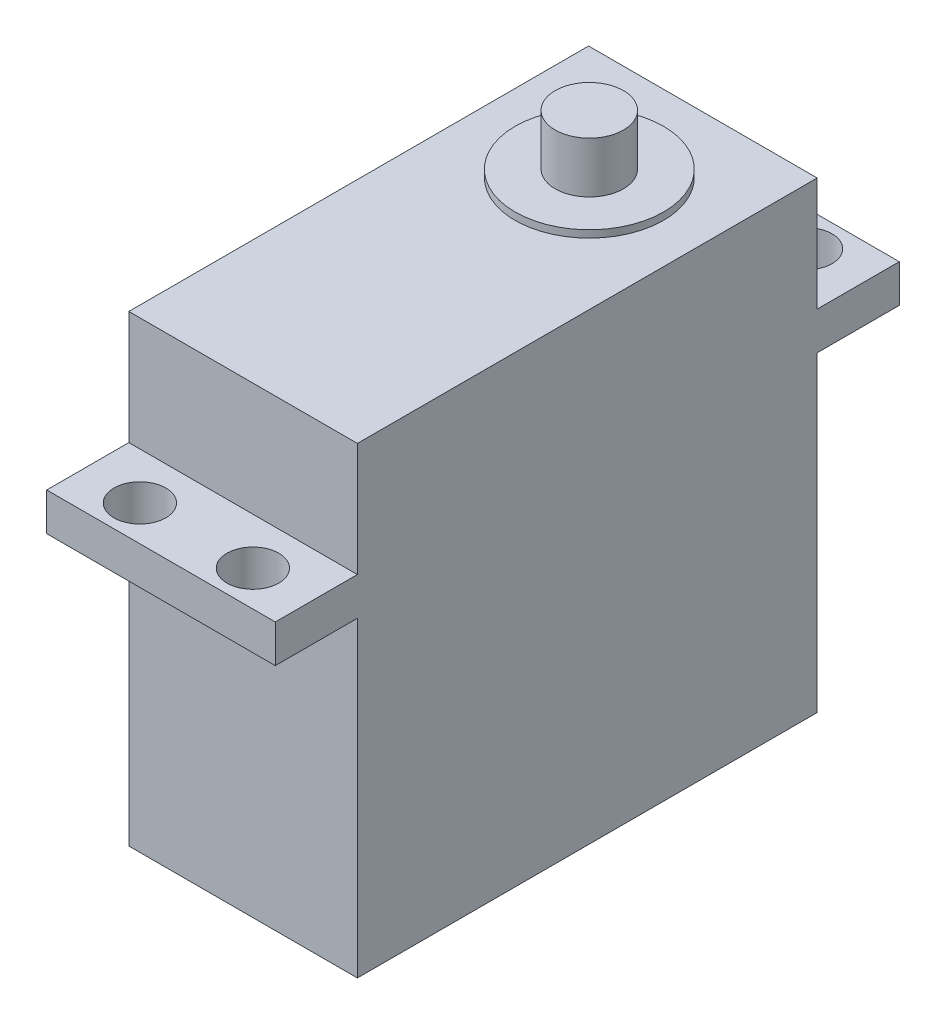
ISO-10303-21;
HEADER;
FILE_DESCRIPTION(('STEP AP214'),'2;1');
FILE_NAME('part.step','',(''),(''),'','','');
FILE_SCHEMA(('AUTOMOTIVE_DESIGN { 1 0 10303 214 1 1 1 1 }'));
ENDSEC;
DATA;
#1=APPLICATION_CONTEXT('core data for automotive mechanical design processes');
#2=APPLICATION_PROTOCOL_DEFINITION('international standard','automotive_design',2000,#1);
#3=PRODUCT_CONTEXT('',#1,'mechanical');
#4=PRODUCT('Part','Part','',(#3));
#5=PRODUCT_RELATED_PRODUCT_CATEGORY('part','',(#4));
#6=PRODUCT_DEFINITION_FORMATION('','',#4);
#7=PRODUCT_DEFINITION_CONTEXT('part definition',#1,'design');
#8=PRODUCT_DEFINITION('design','',#6,#7);
#9=PRODUCT_DEFINITION_SHAPE('','',#8);
#10=(LENGTH_UNIT() NAMED_UNIT(*) SI_UNIT(.MILLI.,.METRE.));
#11=(NAMED_UNIT(*) PLANE_ANGLE_UNIT() SI_UNIT($,.RADIAN.));
#12=(NAMED_UNIT(*) SI_UNIT($,.STERADIAN.) SOLID_ANGLE_UNIT());
#13=UNCERTAINTY_MEASURE_WITH_UNIT(LENGTH_MEASURE(1.E-05),#10,'distance_accuracy_value','');
#14=(GEOMETRIC_REPRESENTATION_CONTEXT(3) GLOBAL_UNCERTAINTY_ASSIGNED_CONTEXT((#13)) GLOBAL_UNIT_ASSIGNED_CONTEXT((#10,
#11,#12)) REPRESENTATION_CONTEXT('',''));
#15=CARTESIAN_POINT('',(0.,0.,0.));
#16=DIRECTION('',(0.,0.,1.));
#17=DIRECTION('',(1.,0.,0.));
#18=AXIS2_PLACEMENT_3D('',#15,#16,#17);
#19=CARTESIAN_POINT('',(19.939,0.,0.));
#20=DIRECTION('',(0.,0.,-1.));
#21=DIRECTION('',(-1.,0.,0.));
#22=AXIS2_PLACEMENT_3D('',#19,#20,#21);
#23=PLANE('',#22);
#24=DIRECTION('',(0.,-1.,0.));
#25=VECTOR('',#24,1.);
#26=CARTESIAN_POINT('',(0.,0.,0.));
#27=LINE('',#26,#25);
#28=CARTESIAN_POINT('',(0.,27.178,0.));
#29=VERTEX_POINT('',#28);
#30=CARTESIAN_POINT('',(0.,0.,0.));
#31=VERTEX_POINT('',#30);
#32=EDGE_CURVE('E168',#29,#31,#27,.T.);
#33=ORIENTED_EDGE('',*,*,#32,.T.);
#34=DIRECTION('',(-1.,0.,0.));
#35=VECTOR('',#34,1.);
#36=CARTESIAN_POINT('',(19.939,0.,0.));
#37=LINE('',#36,#35);
#38=CARTESIAN_POINT('',(19.939,0.,0.));
#39=VERTEX_POINT('',#38);
#40=EDGE_CURVE('E54',#39,#31,#37,.T.);
#41=ORIENTED_EDGE('',*,*,#40,.F.);
#42=DIRECTION('',(0.,-1.,0.));
#43=VECTOR('',#42,1.);
#44=CARTESIAN_POINT('',(19.939,0.,0.));
#45=LINE('',#44,#43);
#46=CARTESIAN_POINT('',(19.939,27.178,0.));
#47=VERTEX_POINT('',#46);
#48=EDGE_CURVE('E191',#47,#39,#45,.T.);
#49=ORIENTED_EDGE('',*,*,#48,.F.);
#50=DIRECTION('',(-1.,0.,0.));
#51=VECTOR('',#50,1.);
#52=CARTESIAN_POINT('',(19.939,27.178,0.));
#53=LINE('',#52,#51);
#54=EDGE_CURVE('E164',#47,#29,#53,.T.);
#55=ORIENTED_EDGE('',*,*,#54,.T.);
#56=EDGE_LOOP('',(#33,#41,#49,#55));
#57=FACE_BOUND('',#56,.T.);
#58=ADVANCED_FACE('F45',(#57),#23,.F.);
#59=CARTESIAN_POINT('',(19.939,0.,0.));
#60=DIRECTION('',(0.,1.,0.));
#61=DIRECTION('',(0.,0.,1.));
#62=AXIS2_PLACEMENT_3D('',#59,#60,#61);
#63=PLANE('',#62);
#64=DIRECTION('',(0.,0.,-1.));
#65=VECTOR('',#64,1.);
#66=CARTESIAN_POINT('',(0.,0.,0.));
#67=LINE('',#66,#65);
#68=CARTESIAN_POINT('',(0.,0.,-40.1066));
#69=VERTEX_POINT('',#68);
#70=EDGE_CURVE('E171',#31,#69,#67,.T.);
#71=ORIENTED_EDGE('',*,*,#70,.T.);
#72=DIRECTION('',(-1.,0.,0.));
#73=VECTOR('',#72,1.);
#74=CARTESIAN_POINT('',(19.939,0.,-40.1066));
#75=LINE('',#74,#73);
#76=CARTESIAN_POINT('',(19.939,0.,-40.1066));
#77=VERTEX_POINT('',#76);
#78=EDGE_CURVE('E213',#77,#69,#75,.T.);
#79=ORIENTED_EDGE('',*,*,#78,.F.);
#80=DIRECTION('',(0.,0.,-1.));
#81=VECTOR('',#80,1.);
#82=CARTESIAN_POINT('',(19.939,0.,0.));
#83=LINE('',#82,#81);
#84=EDGE_CURVE('E119',#39,#77,#83,.T.);
#85=ORIENTED_EDGE('',*,*,#84,.F.);
#86=ORIENTED_EDGE('',*,*,#40,.T.);
#87=EDGE_LOOP('',(#71,#79,#85,#86));
#88=FACE_BOUND('',#87,.T.);
#89=ADVANCED_FACE('F290',(#88),#63,.F.);
#90=CARTESIAN_POINT('',(19.939,0.,-40.1066));
#91=DIRECTION('',(0.,0.,1.));
#92=DIRECTION('',(0.,-1.,0.));
#93=AXIS2_PLACEMENT_3D('',#90,#91,#92);
#94=PLANE('',#93);
#95=DIRECTION('',(0.,1.,0.));
#96=VECTOR('',#95,1.);
#97=CARTESIAN_POINT('',(0.,0.,-40.1066));
#98=LINE('',#97,#96);
#99=CARTESIAN_POINT('',(0.,27.178,-40.1066));
#100=VERTEX_POINT('',#99);
#101=EDGE_CURVE('E174',#69,#100,#98,.T.);
#102=ORIENTED_EDGE('',*,*,#101,.T.);
#103=DIRECTION('',(-1.,0.,0.));
#104=VECTOR('',#103,1.);
#105=CARTESIAN_POINT('',(19.939,27.178,-40.1066));
#106=LINE('',#105,#104);
#107=CARTESIAN_POINT('',(19.939,27.178,-40.1066));
#108=VERTEX_POINT('',#107);
#109=EDGE_CURVE('E210',#108,#100,#106,.T.);
#110=ORIENTED_EDGE('',*,*,#109,.F.);
#111=DIRECTION('',(0.,1.,0.));
#112=VECTOR('',#111,1.);
#113=CARTESIAN_POINT('',(19.939,0.,-40.1066));
#114=LINE('',#113,#112);
#115=EDGE_CURVE('E250',#77,#108,#114,.T.);
#116=ORIENTED_EDGE('',*,*,#115,.F.);
#117=ORIENTED_EDGE('',*,*,#78,.T.);
#118=EDGE_LOOP('',(#102,#110,#116,#117));
#119=FACE_BOUND('',#118,.T.);
#120=ADVANCED_FACE('F294',(#119),#94,.F.);
#121=CARTESIAN_POINT('',(19.939,27.178,-40.1066));
#122=DIRECTION('',(0.,1.,0.));
#123=DIRECTION('',(0.,0.,1.));
#124=AXIS2_PLACEMENT_3D('',#121,#122,#123);
#125=PLANE('',#124);
#126=CARTESIAN_POINT('',(14.8971,27.178,-44.1833));
#127=DIRECTION('',(0.,1.,0.));
#128=DIRECTION('',(0.,0.,1.));
#129=AXIS2_PLACEMENT_3D('',#126,#127,#128);
#130=CIRCLE('',#129,2.2606);
#131=CARTESIAN_POINT('',(14.8971,27.178,-41.9227));
#132=VERTEX_POINT('',#131);
#133=EDGE_CURVE('E241',#132,#132,#130,.T.);
#134=ORIENTED_EDGE('',*,*,#133,.T.);
#135=EDGE_LOOP('',(#134));
#136=FACE_BOUND('',#135,.T.);
#137=CARTESIAN_POINT('',(5.04189999999999,27.178,-44.1833));
#138=DIRECTION('',(0.,1.,0.));
#139=DIRECTION('',(0.,0.,1.));
#140=AXIS2_PLACEMENT_3D('',#137,#138,#139);
#141=CIRCLE('',#140,2.2606);
#142=CARTESIAN_POINT('',(5.04189999999999,27.178,-41.9227));
#143=VERTEX_POINT('',#142);
#144=EDGE_CURVE('E226',#143,#143,#141,.T.);
#145=ORIENTED_EDGE('',*,*,#144,.T.);
#146=EDGE_LOOP('',(#145));
#147=FACE_BOUND('',#146,.T.);
#148=DIRECTION('',(0.,0.,-1.));
#149=VECTOR('',#148,1.);
#150=CARTESIAN_POINT('',(0.,27.178,-40.1066));
#151=LINE('',#150,#149);
#152=CARTESIAN_POINT('',(0.,27.178,-47.2694));
#153=VERTEX_POINT('',#152);
#154=EDGE_CURVE('E176',#100,#153,#151,.T.);
#155=ORIENTED_EDGE('',*,*,#154,.T.);
#156=DIRECTION('',(-1.,0.,0.));
#157=VECTOR('',#156,1.);
#158=CARTESIAN_POINT('',(19.939,27.178,-47.2694));
#159=LINE('',#158,#157);
#160=CARTESIAN_POINT('',(19.939,27.178,-47.2694));
#161=VERTEX_POINT('',#160);
#162=EDGE_CURVE('E207',#161,#153,#159,.T.);
#163=ORIENTED_EDGE('',*,*,#162,.F.);
#164=DIRECTION('',(0.,0.,-1.));
#165=VECTOR('',#164,1.);
#166=CARTESIAN_POINT('',(19.939,27.178,-40.1066));
#167=LINE('',#166,#165);
#168=EDGE_CURVE('E252',#108,#161,#167,.T.);
#169=ORIENTED_EDGE('',*,*,#168,.F.);
#170=ORIENTED_EDGE('',*,*,#109,.T.);
#171=EDGE_LOOP('',(#155,#163,#169,#170));
#172=FACE_BOUND('',#171,.T.);
#173=ADVANCED_FACE('F298',(#136,#147,#172),#125,.F.);
#174=CARTESIAN_POINT('',(19.939,30.48,-47.2694));
#175=DIRECTION('',(0.,0.,1.));
#176=DIRECTION('',(0.,-1.,0.));
#177=AXIS2_PLACEMENT_3D('',#174,#175,#176);
#178=PLANE('',#177);
#179=DIRECTION('',(0.,1.,0.));
#180=VECTOR('',#179,1.);
#181=CARTESIAN_POINT('',(0.,30.48,-47.2694));
#182=LINE('',#181,#180);
#183=CARTESIAN_POINT('',(0.,30.48,-47.2694));
#184=VERTEX_POINT('',#183);
#185=EDGE_CURVE('E178',#153,#184,#182,.T.);
#186=ORIENTED_EDGE('',*,*,#185,.T.);
#187=DIRECTION('',(-1.,0.,0.));
#188=VECTOR('',#187,1.);
#189=CARTESIAN_POINT('',(19.939,30.48,-47.2694));
#190=LINE('',#189,#188);
#191=CARTESIAN_POINT('',(19.939,30.48,-47.2694));
#192=VERTEX_POINT('',#191);
#193=EDGE_CURVE('E204',#192,#184,#190,.T.);
#194=ORIENTED_EDGE('',*,*,#193,.F.);
#195=DIRECTION('',(0.,1.,0.));
#196=VECTOR('',#195,1.);
#197=CARTESIAN_POINT('',(19.939,30.48,-47.2694));
#198=LINE('',#197,#196);
#199=EDGE_CURVE('E254',#161,#192,#198,.T.);
#200=ORIENTED_EDGE('',*,*,#199,.F.);
#201=ORIENTED_EDGE('',*,*,#162,.T.);
#202=EDGE_LOOP('',(#186,#194,#200,#201));
#203=FACE_BOUND('',#202,.T.);
#204=ADVANCED_FACE('F304',(#203),#178,.F.);
#205=CARTESIAN_POINT('',(19.939,30.48,-40.1066));
#206=DIRECTION('',(0.,-1.,0.));
#207=DIRECTION('',(0.,0.,-1.));
#208=AXIS2_PLACEMENT_3D('',#205,#206,#207);
#209=PLANE('',#208);
#210=CARTESIAN_POINT('',(14.8971,30.48,-44.1833));
#211=DIRECTION('',(0.,1.,0.));
#212=DIRECTION('',(0.,0.,-1.));
#213=AXIS2_PLACEMENT_3D('',#210,#211,#212);
#214=CIRCLE('',#213,2.2606);
#215=CARTESIAN_POINT('',(14.8971,30.48,-41.9227));
#216=VERTEX_POINT('',#215);
#217=EDGE_CURVE('E228',#216,#216,#214,.T.);
#218=ORIENTED_EDGE('',*,*,#217,.F.);
#219=EDGE_LOOP('',(#218));
#220=FACE_BOUND('',#219,.T.);
#221=CARTESIAN_POINT('',(5.04189999999999,30.48,-44.1833));
#222=DIRECTION('',(0.,1.,0.));
#223=DIRECTION('',(0.,0.,1.));
#224=AXIS2_PLACEMENT_3D('',#221,#222,#223);
#225=CIRCLE('',#224,2.2606);
#226=CARTESIAN_POINT('',(5.04189999999999,30.48,-41.9227));
#227=VERTEX_POINT('',#226);
#228=EDGE_CURVE('E222',#227,#227,#225,.T.);
#229=ORIENTED_EDGE('',*,*,#228,.F.);
#230=EDGE_LOOP('',(#229));
#231=FACE_BOUND('',#230,.T.);
#232=DIRECTION('',(0.,0.,1.));
#233=VECTOR('',#232,1.);
#234=CARTESIAN_POINT('',(0.,30.48,-40.1066));
#235=LINE('',#234,#233);
#236=CARTESIAN_POINT('',(0.,30.48,-40.1066));
#237=VERTEX_POINT('',#236);
#238=EDGE_CURVE('E180',#184,#237,#235,.T.);
#239=ORIENTED_EDGE('',*,*,#238,.T.);
#240=DIRECTION('',(-1.,0.,0.));
#241=VECTOR('',#240,1.);
#242=CARTESIAN_POINT('',(19.939,30.48,-40.1066));
#243=LINE('',#242,#241);
#244=CARTESIAN_POINT('',(19.939,30.48,-40.1066));
#245=VERTEX_POINT('',#244);
#246=EDGE_CURVE('E201',#245,#237,#243,.T.);
#247=ORIENTED_EDGE('',*,*,#246,.F.);
#248=DIRECTION('',(0.,0.,1.));
#249=VECTOR('',#248,1.);
#250=CARTESIAN_POINT('',(19.939,30.48,-40.1066));
#251=LINE('',#250,#249);
#252=EDGE_CURVE('E256',#192,#245,#251,.T.);
#253=ORIENTED_EDGE('',*,*,#252,.F.);
#254=ORIENTED_EDGE('',*,*,#193,.T.);
#255=EDGE_LOOP('',(#239,#247,#253,#254));
#256=FACE_BOUND('',#255,.T.);
#257=ADVANCED_FACE('F308',(#220,#231,#256),#209,.F.);
#258=CARTESIAN_POINT('',(19.939,30.48,-40.1066));
#259=DIRECTION('',(0.,0.,1.));
#260=DIRECTION('',(1.,0.,0.));
#261=AXIS2_PLACEMENT_3D('',#258,#259,#260);
#262=PLANE('',#261);
#263=DIRECTION('',(0.,1.,0.));
#264=VECTOR('',#263,1.);
#265=CARTESIAN_POINT('',(0.,30.48,-40.1066));
#266=LINE('',#265,#264);
#267=CARTESIAN_POINT('',(0.,40.386,-40.1066));
#268=VERTEX_POINT('',#267);
#269=EDGE_CURVE('E182',#237,#268,#266,.T.);
#270=ORIENTED_EDGE('',*,*,#269,.T.);
#271=DIRECTION('',(-1.,0.,0.));
#272=VECTOR('',#271,1.);
#273=CARTESIAN_POINT('',(19.939,40.386,-40.1066));
#274=LINE('',#273,#272);
#275=CARTESIAN_POINT('',(19.939,40.386,-40.1066));
#276=VERTEX_POINT('',#275);
#277=EDGE_CURVE('E198',#276,#268,#274,.T.);
#278=ORIENTED_EDGE('',*,*,#277,.F.);
#279=DIRECTION('',(0.,1.,0.));
#280=VECTOR('',#279,1.);
#281=CARTESIAN_POINT('',(19.939,30.48,-40.1066));
#282=LINE('',#281,#280);
#283=EDGE_CURVE('E258',#245,#276,#282,.T.);
#284=ORIENTED_EDGE('',*,*,#283,.F.);
#285=ORIENTED_EDGE('',*,*,#246,.T.);
#286=EDGE_LOOP('',(#270,#278,#284,#285));
#287=FACE_BOUND('',#286,.T.);
#288=ADVANCED_FACE('F312',(#287),#262,.F.);
#289=CARTESIAN_POINT('',(19.939,40.386,0.));
#290=DIRECTION('',(0.,-1.,0.));
#291=DIRECTION('',(0.,0.,-1.));
#292=AXIS2_PLACEMENT_3D('',#289,#290,#291);
#293=PLANE('',#292);
#294=CARTESIAN_POINT('',(9.9695,40.386,-30.2006));
#295=DIRECTION('',(0.,-1.,0.));
#296=DIRECTION('',(0.,0.,-1.));
#297=AXIS2_PLACEMENT_3D('',#294,#295,#296);
#298=CIRCLE('',#297,6.477);
#299=CARTESIAN_POINT('',(9.9695,40.386,-36.6776));
#300=VERTEX_POINT('',#299);
#301=EDGE_CURVE('E11',#300,#300,#298,.F.);
#302=ORIENTED_EDGE('',*,*,#301,.F.);
#303=EDGE_LOOP('',(#302));
#304=FACE_BOUND('',#303,.T.);
#305=DIRECTION('',(0.,0.,1.));
#306=VECTOR('',#305,1.);
#307=CARTESIAN_POINT('',(0.,40.386,0.));
#308=LINE('',#307,#306);
#309=CARTESIAN_POINT('',(0.,40.386,0.));
#310=VERTEX_POINT('',#309);
#311=EDGE_CURVE('E184',#268,#310,#308,.T.);
#312=ORIENTED_EDGE('',*,*,#311,.T.);
#313=DIRECTION('',(-1.,0.,0.));
#314=VECTOR('',#313,1.);
#315=CARTESIAN_POINT('',(19.939,40.386,0.));
#316=LINE('',#315,#314);
#317=CARTESIAN_POINT('',(19.939,40.386,0.));
#318=VERTEX_POINT('',#317);
#319=EDGE_CURVE('E195',#318,#310,#316,.T.);
#320=ORIENTED_EDGE('',*,*,#319,.F.);
#321=DIRECTION('',(0.,0.,1.));
#322=VECTOR('',#321,1.);
#323=CARTESIAN_POINT('',(19.939,40.386,0.));
#324=LINE('',#323,#322);
#325=EDGE_CURVE('E260',#276,#318,#324,.T.);
#326=ORIENTED_EDGE('',*,*,#325,.F.);
#327=ORIENTED_EDGE('',*,*,#277,.T.);
#328=EDGE_LOOP('',(#312,#320,#326,#327));
#329=FACE_BOUND('',#328,.T.);
#330=ADVANCED_FACE('F266',(#304,#329),#293,.F.);
#331=CARTESIAN_POINT('',(19.939,30.48,0.));
#332=DIRECTION('',(0.,0.,-1.));
#333=DIRECTION('',(0.,1.,0.));
#334=AXIS2_PLACEMENT_3D('',#331,#332,#333);
#335=PLANE('',#334);
#336=DIRECTION('',(0.,-1.,0.));
#337=VECTOR('',#336,1.);
#338=CARTESIAN_POINT('',(0.,30.48,0.));
#339=LINE('',#338,#337);
#340=CARTESIAN_POINT('',(0.,30.48,0.));
#341=VERTEX_POINT('',#340);
#342=EDGE_CURVE('E186',#310,#341,#339,.T.);
#343=ORIENTED_EDGE('',*,*,#342,.T.);
#344=DIRECTION('',(-1.,0.,0.));
#345=VECTOR('',#344,1.);
#346=CARTESIAN_POINT('',(19.939,30.48,0.));
#347=LINE('',#346,#345);
#348=CARTESIAN_POINT('',(19.939,30.48,0.));
#349=VERTEX_POINT('',#348);
#350=EDGE_CURVE('E159',#349,#341,#347,.T.);
#351=ORIENTED_EDGE('',*,*,#350,.F.);
#352=DIRECTION('',(0.,-1.,0.));
#353=VECTOR('',#352,1.);
#354=CARTESIAN_POINT('',(19.939,30.48,0.));
#355=LINE('',#354,#353);
#356=EDGE_CURVE('E150',#318,#349,#355,.T.);
#357=ORIENTED_EDGE('',*,*,#356,.F.);
#358=ORIENTED_EDGE('',*,*,#319,.T.);
#359=EDGE_LOOP('',(#343,#351,#357,#358));
#360=FACE_BOUND('',#359,.T.);
#361=ADVANCED_FACE('F270',(#360),#335,.F.);
#362=CARTESIAN_POINT('',(19.939,30.48,0.));
#363=DIRECTION('',(0.,-1.,0.));
#364=DIRECTION('',(0.,0.,-1.));
#365=AXIS2_PLACEMENT_3D('',#362,#363,#364);
#366=PLANE('',#365);
#367=CARTESIAN_POINT('',(5.04189999999999,30.48,4.07669999999999));
#368=DIRECTION('',(0.,1.,0.));
#369=DIRECTION('',(0.,0.,-1.));
#370=AXIS2_PLACEMENT_3D('',#367,#368,#369);
#371=CIRCLE('',#370,2.2606);
#372=CARTESIAN_POINT('',(5.04189999999999,30.48,6.33729999999999));
#373=VERTEX_POINT('',#372);
#374=EDGE_CURVE('E237',#373,#373,#371,.T.);
#375=ORIENTED_EDGE('',*,*,#374,.F.);
#376=EDGE_LOOP('',(#375));
#377=FACE_BOUND('',#376,.T.);
#378=CARTESIAN_POINT('',(14.8971,30.48,4.0767));
#379=DIRECTION('',(0.,1.,0.));
#380=DIRECTION('',(0.,0.,1.));
#381=AXIS2_PLACEMENT_3D('',#378,#379,#380);
#382=CIRCLE('',#381,2.2606);
#383=CARTESIAN_POINT('',(14.8971,30.48,6.3373));
#384=VERTEX_POINT('',#383);
#385=EDGE_CURVE('E233',#384,#384,#382,.T.);
#386=ORIENTED_EDGE('',*,*,#385,.F.);
#387=EDGE_LOOP('',(#386));
#388=FACE_BOUND('',#387,.T.);
#389=DIRECTION('',(0.,0.,1.));
#390=VECTOR('',#389,1.);
#391=CARTESIAN_POINT('',(0.,30.48,0.));
#392=LINE('',#391,#390);
#393=CARTESIAN_POINT('',(0.,30.48,7.1628));
#394=VERTEX_POINT('',#393);
#395=EDGE_CURVE('E158',#341,#394,#392,.T.);
#396=ORIENTED_EDGE('',*,*,#395,.T.);
#397=DIRECTION('',(-1.,0.,0.));
#398=VECTOR('',#397,1.);
#399=CARTESIAN_POINT('',(19.939,30.48,7.1628));
#400=LINE('',#399,#398);
#401=CARTESIAN_POINT('',(19.939,30.48,7.1628));
#402=VERTEX_POINT('',#401);
#403=EDGE_CURVE('E155',#402,#394,#400,.T.);
#404=ORIENTED_EDGE('',*,*,#403,.F.);
#405=DIRECTION('',(0.,0.,1.));
#406=VECTOR('',#405,1.);
#407=CARTESIAN_POINT('',(19.939,30.48,0.));
#408=LINE('',#407,#406);
#409=EDGE_CURVE('E144',#349,#402,#408,.T.);
#410=ORIENTED_EDGE('',*,*,#409,.F.);
#411=ORIENTED_EDGE('',*,*,#350,.T.);
#412=EDGE_LOOP('',(#396,#404,#410,#411));
#413=FACE_BOUND('',#412,.T.);
#414=ADVANCED_FACE('F156',(#377,#388,#413),#366,.F.);
#415=CARTESIAN_POINT('',(19.939,30.48,7.1628));
#416=DIRECTION('',(0.,0.,-1.));
#417=DIRECTION('',(0.,1.,0.));
#418=AXIS2_PLACEMENT_3D('',#415,#416,#417);
#419=PLANE('',#418);
#420=DIRECTION('',(0.,-1.,0.));
#421=VECTOR('',#420,1.);
#422=CARTESIAN_POINT('',(0.,30.48,7.1628));
#423=LINE('',#422,#421);
#424=CARTESIAN_POINT('',(0.,27.178,7.1628));
#425=VERTEX_POINT('',#424);
#426=EDGE_CURVE('E104',#394,#425,#423,.T.);
#427=ORIENTED_EDGE('',*,*,#426,.T.);
#428=DIRECTION('',(-1.,0.,0.));
#429=VECTOR('',#428,1.);
#430=CARTESIAN_POINT('',(19.939,27.178,7.1628));
#431=LINE('',#430,#429);
#432=CARTESIAN_POINT('',(19.939,27.178,7.1628));
#433=VERTEX_POINT('',#432);
#434=EDGE_CURVE('E160',#433,#425,#431,.T.);
#435=ORIENTED_EDGE('',*,*,#434,.F.);
#436=DIRECTION('',(0.,-1.,0.));
#437=VECTOR('',#436,1.);
#438=CARTESIAN_POINT('',(19.939,30.48,7.1628));
#439=LINE('',#438,#437);
#440=EDGE_CURVE('E148',#402,#433,#439,.T.);
#441=ORIENTED_EDGE('',*,*,#440,.F.);
#442=ORIENTED_EDGE('',*,*,#403,.T.);
#443=EDGE_LOOP('',(#427,#435,#441,#442));
#444=FACE_BOUND('',#443,.T.);
#445=ADVANCED_FACE('F162',(#444),#419,.F.);
#446=CARTESIAN_POINT('',(19.939,27.178,0.));
#447=DIRECTION('',(0.,1.,0.));
#448=DIRECTION('',(0.,0.,1.));
#449=AXIS2_PLACEMENT_3D('',#446,#447,#448);
#450=PLANE('',#449);
#451=CARTESIAN_POINT('',(5.04189999999999,27.178,4.07669999999999));
#452=DIRECTION('',(0.,1.,0.));
#453=DIRECTION('',(0.,0.,1.));
#454=AXIS2_PLACEMENT_3D('',#451,#452,#453);
#455=CIRCLE('',#454,2.2606);
#456=CARTESIAN_POINT('',(5.04189999999999,27.178,6.33729999999999));
#457=VERTEX_POINT('',#456);
#458=EDGE_CURVE('E48',#457,#457,#455,.T.);
#459=ORIENTED_EDGE('',*,*,#458,.T.);
#460=EDGE_LOOP('',(#459));
#461=FACE_BOUND('',#460,.T.);
#462=CARTESIAN_POINT('',(14.8971,27.178,4.07669999999999));
#463=DIRECTION('',(0.,1.,0.));
#464=DIRECTION('',(0.,0.,1.));
#465=AXIS2_PLACEMENT_3D('',#462,#463,#464);
#466=CIRCLE('',#465,2.2606);
#467=CARTESIAN_POINT('',(14.8971,27.178,6.3373));
#468=VERTEX_POINT('',#467);
#469=EDGE_CURVE('E220',#468,#468,#466,.T.);
#470=ORIENTED_EDGE('',*,*,#469,.T.);
#471=EDGE_LOOP('',(#470));
#472=FACE_BOUND('',#471,.T.);
#473=DIRECTION('',(0.,0.,-1.));
#474=VECTOR('',#473,1.);
#475=CARTESIAN_POINT('',(0.,27.178,0.));
#476=LINE('',#475,#474);
#477=EDGE_CURVE('E110',#425,#29,#476,.T.);
#478=ORIENTED_EDGE('',*,*,#477,.T.);
#479=ORIENTED_EDGE('',*,*,#54,.F.);
#480=DIRECTION('',(0.,0.,-1.));
#481=VECTOR('',#480,1.);
#482=CARTESIAN_POINT('',(19.939,27.178,0.));
#483=LINE('',#482,#481);
#484=EDGE_CURVE('E63',#433,#47,#483,.T.);
#485=ORIENTED_EDGE('',*,*,#484,.F.);
#486=ORIENTED_EDGE('',*,*,#434,.T.);
#487=EDGE_LOOP('',(#478,#479,#485,#486));
#488=FACE_BOUND('',#487,.T.);
#489=ADVANCED_FACE('F278',(#461,#472,#488),#450,.F.);
#490=CARTESIAN_POINT('',(19.939,0.,0.));
#491=DIRECTION('',(1.,0.,0.));
#492=DIRECTION('',(0.,0.,-1.));
#493=AXIS2_PLACEMENT_3D('',#490,#491,#492);
#494=PLANE('',#493);
#495=ORIENTED_EDGE('',*,*,#48,.T.);
#496=ORIENTED_EDGE('',*,*,#84,.T.);
#497=ORIENTED_EDGE('',*,*,#115,.T.);
#498=ORIENTED_EDGE('',*,*,#168,.T.);
#499=ORIENTED_EDGE('',*,*,#199,.T.);
#500=ORIENTED_EDGE('',*,*,#252,.T.);
#501=ORIENTED_EDGE('',*,*,#283,.T.);
#502=ORIENTED_EDGE('',*,*,#325,.T.);
#503=ORIENTED_EDGE('',*,*,#356,.T.);
#504=ORIENTED_EDGE('',*,*,#409,.T.);
#505=ORIENTED_EDGE('',*,*,#440,.T.);
#506=ORIENTED_EDGE('',*,*,#484,.T.);
#507=EDGE_LOOP('',(#495,#496,#497,#498,#499,#500,#501,#502,#503,#504,#505,#506));
#508=FACE_BOUND('',#507,.T.);
#509=ADVANCED_FACE('F146',(#508),#494,.T.);
#510=CARTESIAN_POINT('',(0.,0.,0.));
#511=DIRECTION('',(1.,0.,0.));
#512=DIRECTION('',(0.,0.,-1.));
#513=AXIS2_PLACEMENT_3D('',#510,#511,#512);
#514=PLANE('',#513);
#515=ORIENTED_EDGE('',*,*,#32,.F.);
#516=ORIENTED_EDGE('',*,*,#477,.F.);
#517=ORIENTED_EDGE('',*,*,#426,.F.);
#518=ORIENTED_EDGE('',*,*,#395,.F.);
#519=ORIENTED_EDGE('',*,*,#342,.F.);
#520=ORIENTED_EDGE('',*,*,#311,.F.);
#521=ORIENTED_EDGE('',*,*,#269,.F.);
#522=ORIENTED_EDGE('',*,*,#238,.F.);
#523=ORIENTED_EDGE('',*,*,#185,.F.);
#524=ORIENTED_EDGE('',*,*,#154,.F.);
#525=ORIENTED_EDGE('',*,*,#101,.F.);
#526=ORIENTED_EDGE('',*,*,#70,.F.);
#527=EDGE_LOOP('',(#515,#516,#517,#518,#519,#520,#521,#522,#523,#524,#525,#526));
#528=FACE_BOUND('',#527,.T.);
#529=ADVANCED_FACE('F273',(#528),#514,.F.);
#530=CARTESIAN_POINT('',(9.9695,41.021,-30.2006));
#531=DIRECTION('',(0.,-1.,0.));
#532=DIRECTION('',(0.,0.,-1.));
#533=AXIS2_PLACEMENT_3D('',#530,#531,#532);
#534=CYLINDRICAL_SURFACE('',#533,6.477);
#535=CARTESIAN_POINT('',(9.9695,41.021,-30.2006));
#536=DIRECTION('',(0.,1.,0.));
#537=DIRECTION('',(0.,0.,1.));
#538=AXIS2_PLACEMENT_3D('',#535,#536,#537);
#539=CIRCLE('',#538,6.477);
#540=CARTESIAN_POINT('',(9.9695,41.021,-23.7236));
#541=VERTEX_POINT('',#540);
#542=EDGE_CURVE('E219',#541,#541,#539,.T.);
#543=ORIENTED_EDGE('',*,*,#542,.F.);
#544=EDGE_LOOP('',(#543));
#545=FACE_BOUND('',#544,.T.);
#546=ORIENTED_EDGE('',*,*,#301,.T.);
#547=EDGE_LOOP('',(#546));
#548=FACE_BOUND('',#547,.T.);
#549=ADVANCED_FACE('F354',(#545,#548),#534,.T.);
#550=CARTESIAN_POINT('',(9.9695,41.021,-30.2006));
#551=DIRECTION('',(0.,1.,0.));
#552=DIRECTION('',(0.,0.,1.));
#553=AXIS2_PLACEMENT_3D('',#550,#551,#552);
#554=PLANE('',#553);
#555=CARTESIAN_POINT('',(9.9695,41.021,-30.2006));
#556=DIRECTION('',(0.,1.,0.));
#557=DIRECTION('',(0.,0.,1.));
#558=AXIS2_PLACEMENT_3D('',#555,#556,#557);
#559=CIRCLE('',#558,2.97815);
#560=CARTESIAN_POINT('',(9.9695,41.021,-27.22245));
#561=VERTEX_POINT('',#560);
#562=EDGE_CURVE('E217',#561,#561,#559,.T.);
#563=ORIENTED_EDGE('',*,*,#562,.F.);
#564=EDGE_LOOP('',(#563));
#565=FACE_BOUND('',#564,.T.);
#566=ORIENTED_EDGE('',*,*,#542,.T.);
#567=EDGE_LOOP('',(#566));
#568=FACE_BOUND('',#567,.T.);
#569=ADVANCED_FACE('F350',(#565,#568),#554,.T.);
#570=CARTESIAN_POINT('',(9.9695,45.466,-30.2006));
#571=DIRECTION('',(0.,1.,0.));
#572=DIRECTION('',(0.,0.,1.));
#573=AXIS2_PLACEMENT_3D('',#570,#571,#572);
#574=PLANE('',#573);
#575=CARTESIAN_POINT('',(9.9695,45.466,-30.2006));
#576=DIRECTION('',(0.,1.,0.));
#577=DIRECTION('',(0.,0.,1.));
#578=AXIS2_PLACEMENT_3D('',#575,#576,#577);
#579=CIRCLE('',#578,2.97815);
#580=CARTESIAN_POINT('',(9.9695,45.466,-27.22245));
#581=VERTEX_POINT('',#580);
#582=EDGE_CURVE('E172',#581,#581,#579,.T.);
#583=ORIENTED_EDGE('',*,*,#582,.T.);
#584=EDGE_LOOP('',(#583));
#585=FACE_BOUND('',#584,.T.);
#586=ADVANCED_FACE('F353',(#585),#574,.T.);
#587=CARTESIAN_POINT('',(9.9695,45.466,-30.2006));
#588=DIRECTION('',(0.,-1.,0.));
#589=DIRECTION('',(0.,0.,-1.));
#590=AXIS2_PLACEMENT_3D('',#587,#588,#589);
#591=CYLINDRICAL_SURFACE('',#590,2.97815);
#592=ORIENTED_EDGE('',*,*,#562,.T.);
#593=EDGE_LOOP('',(#592));
#594=FACE_BOUND('',#593,.T.);
#595=ORIENTED_EDGE('',*,*,#582,.F.);
#596=EDGE_LOOP('',(#595));
#597=FACE_BOUND('',#596,.T.);
#598=ADVANCED_FACE('F346',(#594,#597),#591,.T.);
#599=CARTESIAN_POINT('',(14.8971,0.,4.07669999999998));
#600=DIRECTION('',(0.,1.,0.));
#601=DIRECTION('',(0.,0.,1.));
#602=AXIS2_PLACEMENT_3D('',#599,#600,#601);
#603=CYLINDRICAL_SURFACE('',#602,2.2606);
#604=CARTESIAN_POINT('',(14.8971,30.48,6.3373));
#605=CARTESIAN_POINT('',(14.8971,30.4456041666666,6.3373));
#606=CARTESIAN_POINT('',(14.8971,30.4112083333333,6.3373));
#607=CARTESIAN_POINT('',(14.8971,30.3424166666666,6.3373));
#608=CARTESIAN_POINT('',(14.8971,30.3080208333333,6.3373));
#609=CARTESIAN_POINT('',(14.8971,30.2392291666666,6.3373));
#610=CARTESIAN_POINT('',(14.8971,30.2048333333333,6.3373));
#611=CARTESIAN_POINT('',(14.8971,30.1360416666666,6.3373));
#612=CARTESIAN_POINT('',(14.8971,30.1016458333333,6.3373));
#613=CARTESIAN_POINT('',(14.8971,30.0328541666666,6.3373));
#614=CARTESIAN_POINT('',(14.8971,29.9984583333333,6.3373));
#615=CARTESIAN_POINT('',(14.8971,29.9296666666666,6.3373));
#616=CARTESIAN_POINT('',(14.8971,29.8952708333333,6.3373));
#617=CARTESIAN_POINT('',(14.8971,29.8264791666666,6.3373));
#618=CARTESIAN_POINT('',(14.8971,29.7920833333333,6.3373));
#619=CARTESIAN_POINT('',(14.8971,29.7232916666666,6.3373));
#620=CARTESIAN_POINT('',(14.8971,29.6888958333333,6.3373));
#621=CARTESIAN_POINT('',(14.8971,29.6201041666666,6.3373));
#622=CARTESIAN_POINT('',(14.8971,29.5857083333333,6.3373));
#623=CARTESIAN_POINT('',(14.8971,29.5169166666666,6.3373));
#624=CARTESIAN_POINT('',(14.8971,29.4825208333333,6.3373));
#625=CARTESIAN_POINT('',(14.8971,29.4137291666666,6.3373));
#626=CARTESIAN_POINT('',(14.8971,29.3793333333333,6.3373));
#627=CARTESIAN_POINT('',(14.8971,29.3105416666667,6.3373));
#628=CARTESIAN_POINT('',(14.8971,29.2761458333333,6.3373));
#629=CARTESIAN_POINT('',(14.8971,29.2073541666667,6.3373));
#630=CARTESIAN_POINT('',(14.8971,29.1729583333333,6.3373));
#631=CARTESIAN_POINT('',(14.8971,29.1041666666667,6.3373));
#632=CARTESIAN_POINT('',(14.8971,29.0697708333333,6.3373));
#633=CARTESIAN_POINT('',(14.8971,29.0009791666667,6.3373));
#634=CARTESIAN_POINT('',(14.8971,28.9665833333333,6.3373));
#635=CARTESIAN_POINT('',(14.8971,28.8977916666667,6.3373));
#636=CARTESIAN_POINT('',(14.8971,28.8633958333333,6.3373));
#637=CARTESIAN_POINT('',(14.8971,28.7946041666667,6.3373));
#638=CARTESIAN_POINT('',(14.8971,28.7602083333333,6.3373));
#639=CARTESIAN_POINT('',(14.8971,28.6914166666667,6.3373));
#640=CARTESIAN_POINT('',(14.8971,28.6570208333333,6.3373));
#641=CARTESIAN_POINT('',(14.8971,28.5882291666667,6.3373));
#642=CARTESIAN_POINT('',(14.8971,28.5538333333333,6.3373));
#643=CARTESIAN_POINT('',(14.8971,28.4850416666667,6.3373));
#644=CARTESIAN_POINT('',(14.8971,28.4506458333333,6.3373));
#645=CARTESIAN_POINT('',(14.8971,28.3818541666667,6.3373));
#646=CARTESIAN_POINT('',(14.8971,28.3474583333333,6.3373));
#647=CARTESIAN_POINT('',(14.8971,28.2786666666667,6.3373));
#648=CARTESIAN_POINT('',(14.8971,28.2442708333333,6.3373));
#649=CARTESIAN_POINT('',(14.8971,28.1754791666667,6.3373));
#650=CARTESIAN_POINT('',(14.8971,28.1410833333333,6.3373));
#651=CARTESIAN_POINT('',(14.8971,28.0722916666667,6.3373));
#652=CARTESIAN_POINT('',(14.8971,28.0378958333333,6.3373));
#653=CARTESIAN_POINT('',(14.8971,27.9691041666667,6.3373));
#654=CARTESIAN_POINT('',(14.8971,27.9347083333333,6.3373));
#655=CARTESIAN_POINT('',(14.8971,27.8659166666667,6.3373));
#656=CARTESIAN_POINT('',(14.8971,27.8315208333333,6.3373));
#657=CARTESIAN_POINT('',(14.8971,27.7627291666667,6.3373));
#658=CARTESIAN_POINT('',(14.8971,27.7283333333333,6.3373));
#659=CARTESIAN_POINT('',(14.8971,27.6595416666667,6.3373));
#660=CARTESIAN_POINT('',(14.8971,27.6251458333333,6.3373));
#661=CARTESIAN_POINT('',(14.8971,27.5563541666667,6.3373));
#662=CARTESIAN_POINT('',(14.8971,27.5219583333333,6.3373));
#663=CARTESIAN_POINT('',(14.8971,27.4531666666667,6.3373));
#664=CARTESIAN_POINT('',(14.8971,27.4187708333333,6.3373));
#665=CARTESIAN_POINT('',(14.8971,27.3499791666667,6.3373));
#666=CARTESIAN_POINT('',(14.8971,27.3155833333333,6.3373));
#667=CARTESIAN_POINT('',(14.8971,27.2467916666667,6.3373));
#668=CARTESIAN_POINT('',(14.8971,27.2123958333333,6.3373));
#669=CARTESIAN_POINT('',(14.8971,27.178,6.3373));
#670=B_SPLINE_CURVE_WITH_KNOTS('',3,(#604,#605,#606,#607,#608,#609,#610,#611,#612,#613,#614,
#615,#616,#617,#618,#619,#620,#621,#622,#623,#624,#625,#626,#627,#628,#629,#630,#631,#632,#633,
#634,#635,#636,#637,#638,#639,#640,#641,#642,#643,#644,#645,#646,#647,#648,#649,#650,#651,#652,
#653,#654,#655,#656,#657,#658,#659,#660,#661,#662,#663,#664,#665,#666,#667,#668,#669),
.UNSPECIFIED.,.F.,.F.,(4,2,2,2,2,2,2,2,2,2,2,2,2,2,2,2,2,2,2,2,2,2,2,2,2,2,2,2,2,2,2,2,4),(0.,
0.103187500000001,0.206374999999998,0.309562499999999,0.412749999999996,0.515937499999997,
0.619124999999995,0.722312499999995,0.825499999999993,0.928687499999994,1.03187499999999,
1.13506249999999,1.23824999999999,1.34143749999999,1.44462499999999,1.54781249999999,
1.65099999999999,1.75418749999999,1.85737499999999,1.96056249999999,2.06374999999999,
2.16693749999999,2.27012499999998,2.37331249999998,2.47649999999999,2.57968749999998,
2.68287499999998,2.78606249999998,2.88924999999998,2.99243749999998,3.09562499999998,
3.19881249999998,3.30199999999998),.UNSPECIFIED.);
#671=EDGE_CURVE('BSEAM337',#384,#468,#670,.T.);
#672=ORIENTED_EDGE('',*,*,#385,.T.);
#673=ORIENTED_EDGE('',*,*,#469,.F.);
#674=ORIENTED_EDGE('',*,*,#671,.T.);
#675=ORIENTED_EDGE('',*,*,#671,.F.);
#676=EDGE_LOOP('',(#672,#674,#673,#675));
#677=FACE_BOUND('',#676,.T.);
#678=ADVANCED_FACE('F337',(#677),#603,.F.);
#679=CARTESIAN_POINT('',(5.04189999999999,0.,4.07669999999998));
#680=DIRECTION('',(0.,1.,0.));
#681=DIRECTION('',(0.,0.,1.));
#682=AXIS2_PLACEMENT_3D('',#679,#680,#681);
#683=CYLINDRICAL_SURFACE('',#682,2.2606);
#684=CARTESIAN_POINT('',(5.04189999999999,30.48,6.33729999999999));
#685=CARTESIAN_POINT('',(5.04189999999999,30.4456041666666,6.33729999999999));
#686=CARTESIAN_POINT('',(5.04189999999999,30.4112083333333,6.33729999999999));
#687=CARTESIAN_POINT('',(5.04189999999999,30.3424166666666,6.33729999999999));
#688=CARTESIAN_POINT('',(5.04189999999999,30.3080208333333,6.33729999999999));
#689=CARTESIAN_POINT('',(5.04189999999999,30.2392291666666,6.33729999999999));
#690=CARTESIAN_POINT('',(5.04189999999999,30.2048333333333,6.33729999999999));
#691=CARTESIAN_POINT('',(5.04189999999999,30.1360416666666,6.33729999999999));
#692=CARTESIAN_POINT('',(5.04189999999999,30.1016458333333,6.33729999999999));
#693=CARTESIAN_POINT('',(5.04189999999999,30.0328541666666,6.33729999999999));
#694=CARTESIAN_POINT('',(5.04189999999999,29.9984583333333,6.33729999999999));
#695=CARTESIAN_POINT('',(5.04189999999999,29.9296666666666,6.33729999999999));
#696=CARTESIAN_POINT('',(5.04189999999999,29.8952708333333,6.33729999999999));
#697=CARTESIAN_POINT('',(5.04189999999999,29.8264791666666,6.33729999999999));
#698=CARTESIAN_POINT('',(5.04189999999999,29.7920833333333,6.33729999999999));
#699=CARTESIAN_POINT('',(5.04189999999999,29.7232916666666,6.33729999999999));
#700=CARTESIAN_POINT('',(5.04189999999999,29.6888958333333,6.33729999999999));
#701=CARTESIAN_POINT('',(5.04189999999999,29.6201041666666,6.33729999999999));
#702=CARTESIAN_POINT('',(5.04189999999999,29.5857083333333,6.33729999999999));
#703=CARTESIAN_POINT('',(5.04189999999999,29.5169166666666,6.33729999999999));
#704=CARTESIAN_POINT('',(5.04189999999999,29.4825208333333,6.33729999999999));
#705=CARTESIAN_POINT('',(5.04189999999999,29.4137291666666,6.33729999999999));
#706=CARTESIAN_POINT('',(5.04189999999999,29.3793333333333,6.33729999999999));
#707=CARTESIAN_POINT('',(5.04189999999999,29.3105416666667,6.33729999999999));
#708=CARTESIAN_POINT('',(5.04189999999999,29.2761458333333,6.33729999999999));
#709=CARTESIAN_POINT('',(5.04189999999999,29.2073541666667,6.33729999999999));
#710=CARTESIAN_POINT('',(5.04189999999999,29.1729583333333,6.33729999999999));
#711=CARTESIAN_POINT('',(5.04189999999999,29.1041666666667,6.33729999999999));
#712=CARTESIAN_POINT('',(5.04189999999999,29.0697708333333,6.33729999999999));
#713=CARTESIAN_POINT('',(5.04189999999999,29.0009791666667,6.33729999999999));
#714=CARTESIAN_POINT('',(5.04189999999999,28.9665833333333,6.33729999999999));
#715=CARTESIAN_POINT('',(5.04189999999999,28.8977916666667,6.33729999999999));
#716=CARTESIAN_POINT('',(5.04189999999999,28.8633958333333,6.33729999999999));
#717=CARTESIAN_POINT('',(5.04189999999999,28.7946041666667,6.33729999999999));
#718=CARTESIAN_POINT('',(5.04189999999999,28.7602083333333,6.33729999999999));
#719=CARTESIAN_POINT('',(5.04189999999999,28.6914166666667,6.33729999999999));
#720=CARTESIAN_POINT('',(5.04189999999999,28.6570208333333,6.33729999999999));
#721=CARTESIAN_POINT('',(5.04189999999999,28.5882291666667,6.33729999999999));
#722=CARTESIAN_POINT('',(5.04189999999999,28.5538333333333,6.33729999999999));
#723=CARTESIAN_POINT('',(5.04189999999999,28.4850416666667,6.33729999999999));
#724=CARTESIAN_POINT('',(5.04189999999999,28.4506458333333,6.33729999999999));
#725=CARTESIAN_POINT('',(5.04189999999999,28.3818541666667,6.33729999999999));
#726=CARTESIAN_POINT('',(5.04189999999999,28.3474583333333,6.33729999999999));
#727=CARTESIAN_POINT('',(5.04189999999999,28.2786666666667,6.33729999999999));
#728=CARTESIAN_POINT('',(5.04189999999999,28.2442708333333,6.33729999999999));
#729=CARTESIAN_POINT('',(5.04189999999999,28.1754791666667,6.33729999999999));
#730=CARTESIAN_POINT('',(5.04189999999999,28.1410833333333,6.33729999999999));
#731=CARTESIAN_POINT('',(5.04189999999999,28.0722916666667,6.33729999999999));
#732=CARTESIAN_POINT('',(5.04189999999999,28.0378958333333,6.33729999999999));
#733=CARTESIAN_POINT('',(5.04189999999999,27.9691041666667,6.33729999999999));
#734=CARTESIAN_POINT('',(5.04189999999999,27.9347083333333,6.33729999999999));
#735=CARTESIAN_POINT('',(5.04189999999999,27.8659166666667,6.33729999999999));
#736=CARTESIAN_POINT('',(5.04189999999999,27.8315208333333,6.33729999999999));
#737=CARTESIAN_POINT('',(5.04189999999999,27.7627291666667,6.33729999999999));
#738=CARTESIAN_POINT('',(5.04189999999999,27.7283333333333,6.33729999999999));
#739=CARTESIAN_POINT('',(5.04189999999999,27.6595416666667,6.33729999999999));
#740=CARTESIAN_POINT('',(5.04189999999999,27.6251458333333,6.33729999999999));
#741=CARTESIAN_POINT('',(5.04189999999999,27.5563541666667,6.33729999999999));
#742=CARTESIAN_POINT('',(5.04189999999999,27.5219583333333,6.33729999999999));
#743=CARTESIAN_POINT('',(5.04189999999999,27.4531666666667,6.33729999999999));
#744=CARTESIAN_POINT('',(5.04189999999999,27.4187708333333,6.33729999999999));
#745=CARTESIAN_POINT('',(5.04189999999999,27.3499791666667,6.33729999999999));
#746=CARTESIAN_POINT('',(5.04189999999999,27.3155833333333,6.33729999999999));
#747=CARTESIAN_POINT('',(5.04189999999999,27.2467916666667,6.33729999999999));
#748=CARTESIAN_POINT('',(5.04189999999999,27.2123958333333,6.33729999999999));
#749=CARTESIAN_POINT('',(5.04189999999999,27.178,6.33729999999999));
#750=B_SPLINE_CURVE_WITH_KNOTS('',3,(#684,#685,#686,#687,#688,#689,#690,#691,#692,#693,#694,
#695,#696,#697,#698,#699,#700,#701,#702,#703,#704,#705,#706,#707,#708,#709,#710,#711,#712,#713,
#714,#715,#716,#717,#718,#719,#720,#721,#722,#723,#724,#725,#726,#727,#728,#729,#730,#731,#732,
#733,#734,#735,#736,#737,#738,#739,#740,#741,#742,#743,#744,#745,#746,#747,#748,#749),
.UNSPECIFIED.,.F.,.F.,(4,2,2,2,2,2,2,2,2,2,2,2,2,2,2,2,2,2,2,2,2,2,2,2,2,2,2,2,2,2,2,2,4),(0.,
0.103187500000001,0.206374999999998,0.309562499999999,0.412749999999996,0.515937499999997,
0.619124999999995,0.722312499999995,0.825499999999993,0.928687499999994,1.03187499999999,
1.13506249999999,1.23824999999999,1.34143749999999,1.44462499999999,1.54781249999999,
1.65099999999999,1.75418749999999,1.85737499999999,1.96056249999999,2.06374999999999,
2.16693749999999,2.27012499999998,2.37331249999998,2.47649999999999,2.57968749999998,
2.68287499999998,2.78606249999998,2.88924999999998,2.99243749999998,3.09562499999998,
3.19881249999998,3.30199999999998),.UNSPECIFIED.);
#751=EDGE_CURVE('BSEAM333',#373,#457,#750,.T.);
#752=ORIENTED_EDGE('',*,*,#374,.T.);
#753=ORIENTED_EDGE('',*,*,#458,.F.);
#754=ORIENTED_EDGE('',*,*,#751,.T.);
#755=ORIENTED_EDGE('',*,*,#751,.F.);
#756=EDGE_LOOP('',(#752,#754,#753,#755));
#757=FACE_BOUND('',#756,.T.);
#758=ADVANCED_FACE('F333',(#757),#683,.F.);
#759=CARTESIAN_POINT('',(5.04189999999999,0.,-44.1833));
#760=DIRECTION('',(0.,1.,0.));
#761=DIRECTION('',(0.,0.,1.));
#762=AXIS2_PLACEMENT_3D('',#759,#760,#761);
#763=CYLINDRICAL_SURFACE('',#762,2.2606);
#764=CARTESIAN_POINT('',(5.04189999999999,30.48,-41.9227));
#765=CARTESIAN_POINT('',(5.04189999999999,30.4456041666667,-41.9227));
#766=CARTESIAN_POINT('',(5.04189999999999,30.4112083333333,-41.9227));
#767=CARTESIAN_POINT('',(5.04189999999999,30.3424166666667,-41.9227));
#768=CARTESIAN_POINT('',(5.04189999999999,30.3080208333333,-41.9227));
#769=CARTESIAN_POINT('',(5.04189999999999,30.2392291666667,-41.9227));
#770=CARTESIAN_POINT('',(5.04189999999999,30.2048333333333,-41.9227));
#771=CARTESIAN_POINT('',(5.04189999999999,30.1360416666667,-41.9227));
#772=CARTESIAN_POINT('',(5.04189999999999,30.1016458333333,-41.9227));
#773=CARTESIAN_POINT('',(5.04189999999999,30.0328541666667,-41.9227));
#774=CARTESIAN_POINT('',(5.04189999999999,29.9984583333333,-41.9227));
#775=CARTESIAN_POINT('',(5.04189999999999,29.9296666666667,-41.9227));
#776=CARTESIAN_POINT('',(5.04189999999999,29.8952708333333,-41.9227));
#777=CARTESIAN_POINT('',(5.04189999999999,29.8264791666667,-41.9227));
#778=CARTESIAN_POINT('',(5.04189999999999,29.7920833333333,-41.9227));
#779=CARTESIAN_POINT('',(5.04189999999999,29.7232916666667,-41.9227));
#780=CARTESIAN_POINT('',(5.04189999999999,29.6888958333333,-41.9227));
#781=CARTESIAN_POINT('',(5.04189999999999,29.6201041666667,-41.9227));
#782=CARTESIAN_POINT('',(5.04189999999999,29.5857083333333,-41.9227));
#783=CARTESIAN_POINT('',(5.04189999999999,29.5169166666667,-41.9227));
#784=CARTESIAN_POINT('',(5.04189999999999,29.4825208333333,-41.9227));
#785=CARTESIAN_POINT('',(5.04189999999999,29.4137291666667,-41.9227));
#786=CARTESIAN_POINT('',(5.04189999999999,29.3793333333333,-41.9227));
#787=CARTESIAN_POINT('',(5.04189999999999,29.3105416666667,-41.9227));
#788=CARTESIAN_POINT('',(5.04189999999999,29.2761458333333,-41.9227));
#789=CARTESIAN_POINT('',(5.04189999999999,29.2073541666667,-41.9227));
#790=CARTESIAN_POINT('',(5.04189999999999,29.1729583333333,-41.9227));
#791=CARTESIAN_POINT('',(5.04189999999999,29.1041666666667,-41.9227));
#792=CARTESIAN_POINT('',(5.04189999999999,29.0697708333333,-41.9227));
#793=CARTESIAN_POINT('',(5.04189999999999,29.0009791666667,-41.9227));
#794=CARTESIAN_POINT('',(5.04189999999999,28.9665833333333,-41.9227));
#795=CARTESIAN_POINT('',(5.04189999999999,28.8977916666667,-41.9227));
#796=CARTESIAN_POINT('',(5.04189999999999,28.8633958333333,-41.9227));
#797=CARTESIAN_POINT('',(5.04189999999999,28.7946041666667,-41.9227));
#798=CARTESIAN_POINT('',(5.04189999999999,28.7602083333333,-41.9227));
#799=CARTESIAN_POINT('',(5.04189999999999,28.6914166666667,-41.9227));
#800=CARTESIAN_POINT('',(5.04189999999999,28.6570208333333,-41.9227));
#801=CARTESIAN_POINT('',(5.04189999999999,28.5882291666667,-41.9227));
#802=CARTESIAN_POINT('',(5.04189999999999,28.5538333333333,-41.9227));
#803=CARTESIAN_POINT('',(5.04189999999999,28.4850416666667,-41.9227));
#804=CARTESIAN_POINT('',(5.04189999999999,28.4506458333333,-41.9227));
#805=CARTESIAN_POINT('',(5.04189999999999,28.3818541666667,-41.9227));
#806=CARTESIAN_POINT('',(5.04189999999999,28.3474583333333,-41.9227));
#807=CARTESIAN_POINT('',(5.04189999999999,28.2786666666667,-41.9227));
#808=CARTESIAN_POINT('',(5.04189999999999,28.2442708333333,-41.9227));
#809=CARTESIAN_POINT('',(5.04189999999999,28.1754791666667,-41.9227));
#810=CARTESIAN_POINT('',(5.04189999999999,28.1410833333333,-41.9227));
#811=CARTESIAN_POINT('',(5.04189999999999,28.0722916666667,-41.9227));
#812=CARTESIAN_POINT('',(5.04189999999999,28.0378958333333,-41.9227));
#813=CARTESIAN_POINT('',(5.04189999999999,27.9691041666667,-41.9227));
#814=CARTESIAN_POINT('',(5.04189999999999,27.9347083333333,-41.9227));
#815=CARTESIAN_POINT('',(5.04189999999999,27.8659166666667,-41.9227));
#816=CARTESIAN_POINT('',(5.04189999999999,27.8315208333333,-41.9227));
#817=CARTESIAN_POINT('',(5.04189999999999,27.7627291666667,-41.9227));
#818=CARTESIAN_POINT('',(5.04189999999999,27.7283333333333,-41.9227));
#819=CARTESIAN_POINT('',(5.04189999999999,27.6595416666667,-41.9227));
#820=CARTESIAN_POINT('',(5.04189999999999,27.6251458333333,-41.9227));
#821=CARTESIAN_POINT('',(5.04189999999999,27.5563541666667,-41.9227));
#822=CARTESIAN_POINT('',(5.04189999999999,27.5219583333333,-41.9227));
#823=CARTESIAN_POINT('',(5.04189999999999,27.4531666666667,-41.9227));
#824=CARTESIAN_POINT('',(5.04189999999999,27.4187708333333,-41.9227));
#825=CARTESIAN_POINT('',(5.04189999999999,27.3499791666667,-41.9227));
#826=CARTESIAN_POINT('',(5.04189999999999,27.3155833333333,-41.9227));
#827=CARTESIAN_POINT('',(5.04189999999999,27.2467916666667,-41.9227));
#828=CARTESIAN_POINT('',(5.04189999999999,27.2123958333333,-41.9227));
#829=CARTESIAN_POINT('',(5.04189999999999,27.178,-41.9227));
#830=B_SPLINE_CURVE_WITH_KNOTS('',3,(#764,#765,#766,#767,#768,#769,#770,#771,#772,#773,#774,
#775,#776,#777,#778,#779,#780,#781,#782,#783,#784,#785,#786,#787,#788,#789,#790,#791,#792,#793,
#794,#795,#796,#797,#798,#799,#800,#801,#802,#803,#804,#805,#806,#807,#808,#809,#810,#811,#812,
#813,#814,#815,#816,#817,#818,#819,#820,#821,#822,#823,#824,#825,#826,#827,#828,#829),
.UNSPECIFIED.,.F.,.F.,(4,2,2,2,2,2,2,2,2,2,2,2,2,2,2,2,2,2,2,2,2,2,2,2,2,2,2,2,2,2,2,2,4),(0.,
0.103187500000001,0.206375000000002,0.309562499999999,0.41275,0.515937500000001,
0.619124999999998,0.722312499999999,0.8255,0.928687500000001,1.031875,1.1350625,1.23825,
1.3414375,1.444625,1.5478125,1.651,1.7541875,1.857375,1.9605625,2.06375,2.1669375,2.270125,
2.3733125,2.4765,2.5796875,2.682875,2.7860625,2.88925,2.9924375,3.095625,3.1988125,3.302),.UNSPECIFIED.);
#831=EDGE_CURVE('BSEAM336',#227,#143,#830,.T.);
#832=ORIENTED_EDGE('',*,*,#228,.T.);
#833=ORIENTED_EDGE('',*,*,#144,.F.);
#834=ORIENTED_EDGE('',*,*,#831,.T.);
#835=ORIENTED_EDGE('',*,*,#831,.F.);
#836=EDGE_LOOP('',(#832,#834,#833,#835));
#837=FACE_BOUND('',#836,.T.);
#838=ADVANCED_FACE('F336',(#837),#763,.F.);
#839=CARTESIAN_POINT('',(14.8971,0.,-44.1833));
#840=DIRECTION('',(0.,1.,0.));
#841=DIRECTION('',(0.,0.,1.));
#842=AXIS2_PLACEMENT_3D('',#839,#840,#841);
#843=CYLINDRICAL_SURFACE('',#842,2.2606);
#844=CARTESIAN_POINT('',(14.8971,30.48,-41.9227));
#845=CARTESIAN_POINT('',(14.8971,30.4456041666667,-41.9227));
#846=CARTESIAN_POINT('',(14.8971,30.4112083333333,-41.9227));
#847=CARTESIAN_POINT('',(14.8971,30.3424166666667,-41.9227));
#848=CARTESIAN_POINT('',(14.8971,30.3080208333333,-41.9227));
#849=CARTESIAN_POINT('',(14.8971,30.2392291666667,-41.9227));
#850=CARTESIAN_POINT('',(14.8971,30.2048333333333,-41.9227));
#851=CARTESIAN_POINT('',(14.8971,30.1360416666667,-41.9227));
#852=CARTESIAN_POINT('',(14.8971,30.1016458333333,-41.9227));
#853=CARTESIAN_POINT('',(14.8971,30.0328541666667,-41.9227));
#854=CARTESIAN_POINT('',(14.8971,29.9984583333333,-41.9227));
#855=CARTESIAN_POINT('',(14.8971,29.9296666666667,-41.9227));
#856=CARTESIAN_POINT('',(14.8971,29.8952708333333,-41.9227));
#857=CARTESIAN_POINT('',(14.8971,29.8264791666667,-41.9227));
#858=CARTESIAN_POINT('',(14.8971,29.7920833333333,-41.9227));
#859=CARTESIAN_POINT('',(14.8971,29.7232916666667,-41.9227));
#860=CARTESIAN_POINT('',(14.8971,29.6888958333333,-41.9227));
#861=CARTESIAN_POINT('',(14.8971,29.6201041666667,-41.9227));
#862=CARTESIAN_POINT('',(14.8971,29.5857083333333,-41.9227));
#863=CARTESIAN_POINT('',(14.8971,29.5169166666667,-41.9227));
#864=CARTESIAN_POINT('',(14.8971,29.4825208333333,-41.9227));
#865=CARTESIAN_POINT('',(14.8971,29.4137291666667,-41.9227));
#866=CARTESIAN_POINT('',(14.8971,29.3793333333333,-41.9227));
#867=CARTESIAN_POINT('',(14.8971,29.3105416666667,-41.9227));
#868=CARTESIAN_POINT('',(14.8971,29.2761458333333,-41.9227));
#869=CARTESIAN_POINT('',(14.8971,29.2073541666667,-41.9227));
#870=CARTESIAN_POINT('',(14.8971,29.1729583333333,-41.9227));
#871=CARTESIAN_POINT('',(14.8971,29.1041666666667,-41.9227));
#872=CARTESIAN_POINT('',(14.8971,29.0697708333333,-41.9227));
#873=CARTESIAN_POINT('',(14.8971,29.0009791666667,-41.9227));
#874=CARTESIAN_POINT('',(14.8971,28.9665833333333,-41.9227));
#875=CARTESIAN_POINT('',(14.8971,28.8977916666667,-41.9227));
#876=CARTESIAN_POINT('',(14.8971,28.8633958333333,-41.9227));
#877=CARTESIAN_POINT('',(14.8971,28.7946041666667,-41.9227));
#878=CARTESIAN_POINT('',(14.8971,28.7602083333333,-41.9227));
#879=CARTESIAN_POINT('',(14.8971,28.6914166666667,-41.9227));
#880=CARTESIAN_POINT('',(14.8971,28.6570208333333,-41.9227));
#881=CARTESIAN_POINT('',(14.8971,28.5882291666667,-41.9227));
#882=CARTESIAN_POINT('',(14.8971,28.5538333333333,-41.9227));
#883=CARTESIAN_POINT('',(14.8971,28.4850416666667,-41.9227));
#884=CARTESIAN_POINT('',(14.8971,28.4506458333333,-41.9227));
#885=CARTESIAN_POINT('',(14.8971,28.3818541666667,-41.9227));
#886=CARTESIAN_POINT('',(14.8971,28.3474583333333,-41.9227));
#887=CARTESIAN_POINT('',(14.8971,28.2786666666667,-41.9227));
#888=CARTESIAN_POINT('',(14.8971,28.2442708333333,-41.9227));
#889=CARTESIAN_POINT('',(14.8971,28.1754791666667,-41.9227));
#890=CARTESIAN_POINT('',(14.8971,28.1410833333333,-41.9227));
#891=CARTESIAN_POINT('',(14.8971,28.0722916666667,-41.9227));
#892=CARTESIAN_POINT('',(14.8971,28.0378958333333,-41.9227));
#893=CARTESIAN_POINT('',(14.8971,27.9691041666667,-41.9227));
#894=CARTESIAN_POINT('',(14.8971,27.9347083333333,-41.9227));
#895=CARTESIAN_POINT('',(14.8971,27.8659166666667,-41.9227));
#896=CARTESIAN_POINT('',(14.8971,27.8315208333333,-41.9227));
#897=CARTESIAN_POINT('',(14.8971,27.7627291666667,-41.9227));
#898=CARTESIAN_POINT('',(14.8971,27.7283333333333,-41.9227));
#899=CARTESIAN_POINT('',(14.8971,27.6595416666667,-41.9227));
#900=CARTESIAN_POINT('',(14.8971,27.6251458333333,-41.9227));
#901=CARTESIAN_POINT('',(14.8971,27.5563541666667,-41.9227));
#902=CARTESIAN_POINT('',(14.8971,27.5219583333333,-41.9227));
#903=CARTESIAN_POINT('',(14.8971,27.4531666666667,-41.9227));
#904=CARTESIAN_POINT('',(14.8971,27.4187708333333,-41.9227));
#905=CARTESIAN_POINT('',(14.8971,27.3499791666667,-41.9227));
#906=CARTESIAN_POINT('',(14.8971,27.3155833333333,-41.9227));
#907=CARTESIAN_POINT('',(14.8971,27.2467916666667,-41.9227));
#908=CARTESIAN_POINT('',(14.8971,27.2123958333333,-41.9227));
#909=CARTESIAN_POINT('',(14.8971,27.178,-41.9227));
#910=B_SPLINE_CURVE_WITH_KNOTS('',3,(#844,#845,#846,#847,#848,#849,#850,#851,#852,#853,#854,
#855,#856,#857,#858,#859,#860,#861,#862,#863,#864,#865,#866,#867,#868,#869,#870,#871,#872,#873,
#874,#875,#876,#877,#878,#879,#880,#881,#882,#883,#884,#885,#886,#887,#888,#889,#890,#891,#892,
#893,#894,#895,#896,#897,#898,#899,#900,#901,#902,#903,#904,#905,#906,#907,#908,#909),
.UNSPECIFIED.,.F.,.F.,(4,2,2,2,2,2,2,2,2,2,2,2,2,2,2,2,2,2,2,2,2,2,2,2,2,2,2,2,2,2,2,2,4),(0.,
0.103187500000001,0.206375000000002,0.309562499999999,0.41275,0.515937500000001,
0.619124999999998,0.722312499999999,0.8255,0.928687500000001,1.031875,1.1350625,1.23825,
1.3414375,1.444625,1.5478125,1.651,1.7541875,1.857375,1.9605625,2.06375,2.1669375,2.270125,
2.3733125,2.4765,2.5796875,2.682875,2.7860625,2.88925,2.9924375,3.095625,3.1988125,3.302),.UNSPECIFIED.);
#911=EDGE_CURVE('BSEAM344',#216,#132,#910,.T.);
#912=ORIENTED_EDGE('',*,*,#217,.T.);
#913=ORIENTED_EDGE('',*,*,#133,.F.);
#914=ORIENTED_EDGE('',*,*,#911,.T.);
#915=ORIENTED_EDGE('',*,*,#911,.F.);
#916=EDGE_LOOP('',(#912,#914,#913,#915));
#917=FACE_BOUND('',#916,.T.);
#918=ADVANCED_FACE('F344',(#917),#843,.F.);
#919=CLOSED_SHELL('',(#58,#89,#120,#173,#204,#257,#288,#330,#361,#414,#445,#489,#509,#529,#549,
#569,#586,#598,#678,#758,#838,#918));
#920=MANIFOLD_SOLID_BREP('B2',#919);
#921=ADVANCED_BREP_SHAPE_REPRESENTATION('',(#18,#920),#14);
#922=SHAPE_DEFINITION_REPRESENTATION(#9,#921);
ENDSEC;
END-ISO-10303-21;
